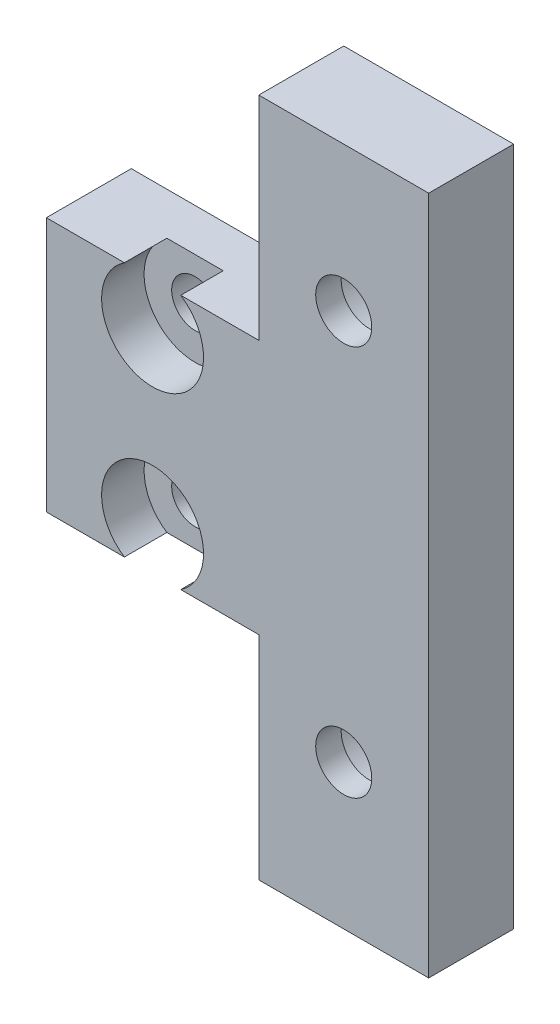
ISO-10303-21;
HEADER;
FILE_DESCRIPTION(('STEP AP214'),'2;1');
FILE_NAME('part.step','',(''),(''),'','','');
FILE_SCHEMA(('AUTOMOTIVE_DESIGN { 1 0 10303 214 1 1 1 1 }'));
ENDSEC;
DATA;
#1=APPLICATION_CONTEXT('core data for automotive mechanical design processes');
#2=APPLICATION_PROTOCOL_DEFINITION('international standard','automotive_design',2000,#1);
#3=PRODUCT_CONTEXT('',#1,'mechanical');
#4=PRODUCT('Part','Part','',(#3));
#5=PRODUCT_RELATED_PRODUCT_CATEGORY('part','',(#4));
#6=PRODUCT_DEFINITION_FORMATION('','',#4);
#7=PRODUCT_DEFINITION_CONTEXT('part definition',#1,'design');
#8=PRODUCT_DEFINITION('design','',#6,#7);
#9=PRODUCT_DEFINITION_SHAPE('','',#8);
#10=(LENGTH_UNIT() NAMED_UNIT(*) SI_UNIT(.MILLI.,.METRE.));
#11=(NAMED_UNIT(*) PLANE_ANGLE_UNIT() SI_UNIT($,.RADIAN.));
#12=(NAMED_UNIT(*) SI_UNIT($,.STERADIAN.) SOLID_ANGLE_UNIT());
#13=UNCERTAINTY_MEASURE_WITH_UNIT(LENGTH_MEASURE(1.E-05),#10,'distance_accuracy_value','');
#14=(GEOMETRIC_REPRESENTATION_CONTEXT(3) GLOBAL_UNCERTAINTY_ASSIGNED_CONTEXT((#13)) GLOBAL_UNIT_ASSIGNED_CONTEXT((#10,
#11,#12)) REPRESENTATION_CONTEXT('',''));
#15=CARTESIAN_POINT('',(0.,0.,0.));
#16=DIRECTION('',(0.,0.,1.));
#17=DIRECTION('',(1.,0.,0.));
#18=AXIS2_PLACEMENT_3D('',#15,#16,#17);
#19=CARTESIAN_POINT('',(-1.16433551558556,10.8998339602697,10.));
#20=DIRECTION('',(0.,0.,-1.));
#21=DIRECTION('',(-1.,0.,0.));
#22=AXIS2_PLACEMENT_3D('',#19,#20,#21);
#23=CYLINDRICAL_SURFACE('',#22,3.3);
#24=CARTESIAN_POINT('',(-1.16433551558556,10.8998339602697,10.));
#25=DIRECTION('',(0.,0.,1.));
#26=DIRECTION('',(1.,0.,0.));
#27=AXIS2_PLACEMENT_3D('',#24,#25,#26);
#28=CIRCLE('',#27,3.3);
#29=CARTESIAN_POINT('',(2.13566448441444,10.8998339602697,10.));
#30=VERTEX_POINT('',#29);
#31=EDGE_CURVE('E168',#30,#30,#28,.T.);
#32=ORIENTED_EDGE('',*,*,#31,.T.);
#33=EDGE_LOOP('',(#32));
#34=FACE_BOUND('',#33,.T.);
#35=CARTESIAN_POINT('',(-1.16433551558556,10.8998339602697,7.));
#36=DIRECTION('',(0.,0.,-1.));
#37=DIRECTION('',(-1.,0.,0.));
#38=AXIS2_PLACEMENT_3D('',#35,#36,#37);
#39=CIRCLE('',#38,3.3);
#40=CARTESIAN_POINT('',(-4.46433551558556,10.8998339602697,7.));
#41=VERTEX_POINT('',#40);
#42=EDGE_CURVE('E40',#41,#41,#39,.T.);
#43=ORIENTED_EDGE('',*,*,#42,.T.);
#44=EDGE_LOOP('',(#43));
#45=FACE_BOUND('',#44,.T.);
#46=ADVANCED_FACE('F36',(#34,#45),#23,.F.);
#47=CARTESIAN_POINT('',(-1.16433551558556,-35.1001660397303,10.));
#48=DIRECTION('',(0.,0.,-1.));
#49=DIRECTION('',(-1.,0.,0.));
#50=AXIS2_PLACEMENT_3D('',#47,#48,#49);
#51=CYLINDRICAL_SURFACE('',#50,3.3);
#52=CARTESIAN_POINT('',(-1.16433551558556,-35.1001660397303,10.));
#53=DIRECTION('',(0.,0.,1.));
#54=DIRECTION('',(1.,0.,0.));
#55=AXIS2_PLACEMENT_3D('',#52,#53,#54);
#56=CIRCLE('',#55,3.3);
#57=CARTESIAN_POINT('',(2.13566448441444,-35.1001660397303,10.));
#58=VERTEX_POINT('',#57);
#59=EDGE_CURVE('E246',#58,#58,#56,.T.);
#60=ORIENTED_EDGE('',*,*,#59,.T.);
#61=EDGE_LOOP('',(#60));
#62=FACE_BOUND('',#61,.T.);
#63=CARTESIAN_POINT('',(-1.16433551558556,-35.1001660397303,7.));
#64=DIRECTION('',(0.,0.,-1.));
#65=DIRECTION('',(-1.,0.,0.));
#66=AXIS2_PLACEMENT_3D('',#63,#64,#65);
#67=CIRCLE('',#66,3.3);
#68=CARTESIAN_POINT('',(-4.46433551558556,-35.1001660397303,7.));
#69=VERTEX_POINT('',#68);
#70=EDGE_CURVE('E214',#69,#69,#67,.T.);
#71=ORIENTED_EDGE('',*,*,#70,.T.);
#72=EDGE_LOOP('',(#71));
#73=FACE_BOUND('',#72,.T.);
#74=ADVANCED_FACE('F308',(#62,#73),#51,.F.);
#75=CARTESIAN_POINT('',(-23.6643355155856,-2.10016603973031,10.));
#76=DIRECTION('',(0.,0.,-1.));
#77=DIRECTION('',(-1.,0.,0.));
#78=AXIS2_PLACEMENT_3D('',#75,#76,#77);
#79=CYLINDRICAL_SURFACE('',#78,2.75);
#80=CARTESIAN_POINT('',(-23.6643355155856,-2.10016603973031,0.));
#81=DIRECTION('',(0.,0.,1.));
#82=DIRECTION('',(1.,0.,0.));
#83=AXIS2_PLACEMENT_3D('',#80,#81,#82);
#84=CIRCLE('',#83,2.75);
#85=CARTESIAN_POINT('',(-20.9143355155856,-2.10016603973031,0.));
#86=VERTEX_POINT('',#85);
#87=EDGE_CURVE('E243',#86,#86,#84,.T.);
#88=ORIENTED_EDGE('',*,*,#87,.F.);
#89=EDGE_LOOP('',(#88));
#90=FACE_BOUND('',#89,.T.);
#91=CARTESIAN_POINT('',(-23.6643355155856,-2.10016603973031,5.));
#92=DIRECTION('',(0.,0.,1.));
#93=DIRECTION('',(1.,0.,0.));
#94=AXIS2_PLACEMENT_3D('',#91,#92,#93);
#95=CIRCLE('',#94,2.75);
#96=CARTESIAN_POINT('',(-20.9143355155856,-2.10016603973031,5.));
#97=VERTEX_POINT('',#96);
#98=EDGE_CURVE('E208',#97,#97,#95,.T.);
#99=ORIENTED_EDGE('',*,*,#98,.T.);
#100=EDGE_LOOP('',(#99));
#101=FACE_BOUND('',#100,.T.);
#102=ADVANCED_FACE('F314',(#90,#101),#79,.F.);
#103=CARTESIAN_POINT('',(-23.6643355155856,-22.1001660397303,10.));
#104=DIRECTION('',(0.,0.,-1.));
#105=DIRECTION('',(-1.,0.,0.));
#106=AXIS2_PLACEMENT_3D('',#103,#104,#105);
#107=CYLINDRICAL_SURFACE('',#106,2.75);
#108=CARTESIAN_POINT('',(-23.6643355155856,-22.1001660397303,0.));
#109=DIRECTION('',(0.,0.,1.));
#110=DIRECTION('',(1.,0.,0.));
#111=AXIS2_PLACEMENT_3D('',#108,#109,#110);
#112=CIRCLE('',#111,2.75);
#113=CARTESIAN_POINT('',(-20.9143355155856,-22.1001660397303,0.));
#114=VERTEX_POINT('',#113);
#115=EDGE_CURVE('E240',#114,#114,#112,.T.);
#116=ORIENTED_EDGE('',*,*,#115,.F.);
#117=EDGE_LOOP('',(#116));
#118=FACE_BOUND('',#117,.T.);
#119=CARTESIAN_POINT('',(-23.6643355155856,-22.1001660397303,5.));
#120=DIRECTION('',(0.,0.,1.));
#121=DIRECTION('',(1.,0.,0.));
#122=AXIS2_PLACEMENT_3D('',#119,#120,#121);
#123=CIRCLE('',#122,2.75);
#124=CARTESIAN_POINT('',(-20.9143355155856,-22.1001660397303,5.));
#125=VERTEX_POINT('',#124);
#126=EDGE_CURVE('E205',#125,#125,#123,.T.);
#127=ORIENTED_EDGE('',*,*,#126,.T.);
#128=EDGE_LOOP('',(#127));
#129=FACE_BOUND('',#128,.T.);
#130=ADVANCED_FACE('F322',(#118,#129),#107,.F.);
#131=CARTESIAN_POINT('',(0.,0.,10.));
#132=DIRECTION('',(0.,0.,-1.));
#133=DIRECTION('',(-1.,0.,0.));
#134=AXIS2_PLACEMENT_3D('',#131,#132,#133);
#135=PLANE('',#134);
#136=DIRECTION('',(-1.,0.,0.));
#137=VECTOR('',#136,1.);
#138=CARTESIAN_POINT('',(-11.1643355155856,2.89983396026969,10.));
#139=LINE('',#138,#137);
#140=CARTESIAN_POINT('',(-11.1643355155856,2.89983396026969,10.));
#141=VERTEX_POINT('',#140);
#142=CARTESIAN_POINT('',(-20.3477107252302,2.89983396026969,10.));
#143=VERTEX_POINT('',#142);
#144=EDGE_CURVE('E253',#141,#143,#139,.T.);
#145=ORIENTED_EDGE('',*,*,#144,.T.);
#146=CARTESIAN_POINT('',(-23.6643355155856,-2.10016603973031,10.));
#147=DIRECTION('',(0.,0.,1.));
#148=DIRECTION('',(1.,0.,0.));
#149=AXIS2_PLACEMENT_3D('',#146,#147,#148);
#150=CIRCLE('',#149,6.);
#151=CARTESIAN_POINT('',(-26.980960305941,2.89983396026969,10.));
#152=VERTEX_POINT('',#151);
#153=EDGE_CURVE('E235',#152,#143,#150,.T.);
#154=ORIENTED_EDGE('',*,*,#153,.F.);
#155=CARTESIAN_POINT('',(-36.1643355155856,2.89983396026969,10.));
#156=VERTEX_POINT('',#155);
#157=EDGE_CURVE('E252',#152,#156,#139,.T.);
#158=ORIENTED_EDGE('',*,*,#157,.T.);
#159=DIRECTION('',(0.,-1.,0.));
#160=VECTOR('',#159,1.);
#161=CARTESIAN_POINT('',(-36.1643355155856,2.89983396026969,10.));
#162=LINE('',#161,#160);
#163=CARTESIAN_POINT('',(-36.1643355155856,-27.1001660397303,10.));
#164=VERTEX_POINT('',#163);
#165=EDGE_CURVE('E148',#156,#164,#162,.T.);
#166=ORIENTED_EDGE('',*,*,#165,.T.);
#167=DIRECTION('',(1.,0.,0.));
#168=VECTOR('',#167,1.);
#169=CARTESIAN_POINT('',(-36.1643355155856,-27.1001660397303,10.));
#170=LINE('',#169,#168);
#171=CARTESIAN_POINT('',(-26.980960305941,-27.1001660397303,10.));
#172=VERTEX_POINT('',#171);
#173=EDGE_CURVE('E141',#164,#172,#170,.T.);
#174=ORIENTED_EDGE('',*,*,#173,.T.);
#175=CARTESIAN_POINT('',(-23.6643355155856,-22.1001660397303,10.));
#176=DIRECTION('',(0.,0.,1.));
#177=DIRECTION('',(1.,0.,0.));
#178=AXIS2_PLACEMENT_3D('',#175,#176,#177);
#179=CIRCLE('',#178,6.);
#180=CARTESIAN_POINT('',(-20.3477107252302,-27.1001660397303,10.));
#181=VERTEX_POINT('',#180);
#182=EDGE_CURVE('E126',#181,#172,#179,.T.);
#183=ORIENTED_EDGE('',*,*,#182,.F.);
#184=CARTESIAN_POINT('',(-11.1643355155856,-27.1001660397303,10.));
#185=VERTEX_POINT('',#184);
#186=EDGE_CURVE('E151',#181,#185,#170,.T.);
#187=ORIENTED_EDGE('',*,*,#186,.T.);
#188=DIRECTION('',(0.,-1.,0.));
#189=VECTOR('',#188,1.);
#190=CARTESIAN_POINT('',(-11.1643355155856,-27.1001660397303,10.));
#191=LINE('',#190,#189);
#192=CARTESIAN_POINT('',(-11.1643355155855,-52.1001660397303,10.));
#193=VERTEX_POINT('',#192);
#194=EDGE_CURVE('E150',#185,#193,#191,.T.);
#195=ORIENTED_EDGE('',*,*,#194,.T.);
#196=DIRECTION('',(1.,0.,0.));
#197=VECTOR('',#196,1.);
#198=CARTESIAN_POINT('',(-11.1643355155855,-52.1001660397303,10.));
#199=LINE('',#198,#197);
#200=CARTESIAN_POINT('',(8.83566448441443,-52.1001660397303,10.));
#201=VERTEX_POINT('',#200);
#202=EDGE_CURVE('E153',#193,#201,#199,.T.);
#203=ORIENTED_EDGE('',*,*,#202,.T.);
#204=DIRECTION('',(0.,1.,0.));
#205=VECTOR('',#204,1.);
#206=CARTESIAN_POINT('',(8.83566448441443,27.8998339602697,10.));
#207=LINE('',#206,#205);
#208=CARTESIAN_POINT('',(8.83566448441443,27.8998339602697,10.));
#209=VERTEX_POINT('',#208);
#210=EDGE_CURVE('E159',#201,#209,#207,.T.);
#211=ORIENTED_EDGE('',*,*,#210,.T.);
#212=DIRECTION('',(-1.,0.,0.));
#213=VECTOR('',#212,1.);
#214=CARTESIAN_POINT('',(8.83566448441443,27.8998339602697,10.));
#215=LINE('',#214,#213);
#216=CARTESIAN_POINT('',(-11.1643355155856,27.8998339602697,10.));
#217=VERTEX_POINT('',#216);
#218=EDGE_CURVE('E161',#209,#217,#215,.T.);
#219=ORIENTED_EDGE('',*,*,#218,.T.);
#220=DIRECTION('',(0.,-1.,0.));
#221=VECTOR('',#220,1.);
#222=CARTESIAN_POINT('',(-11.1643355155856,27.8998339602697,10.));
#223=LINE('',#222,#221);
#224=EDGE_CURVE('E182',#217,#141,#223,.T.);
#225=ORIENTED_EDGE('',*,*,#224,.T.);
#226=EDGE_LOOP('',(#145,#154,#158,#166,#174,#183,#187,#195,#203,#211,#219,#225));
#227=FACE_BOUND('',#226,.T.);
#228=ORIENTED_EDGE('',*,*,#31,.F.);
#229=EDGE_LOOP('',(#228));
#230=FACE_BOUND('',#229,.T.);
#231=ORIENTED_EDGE('',*,*,#59,.F.);
#232=EDGE_LOOP('',(#231));
#233=FACE_BOUND('',#232,.T.);
#234=ADVANCED_FACE('F145',(#227,#230,#233),#135,.F.);
#235=CARTESIAN_POINT('',(0.,0.,0.));
#236=DIRECTION('',(0.,0.,-1.));
#237=DIRECTION('',(-1.,0.,0.));
#238=AXIS2_PLACEMENT_3D('',#235,#236,#237);
#239=PLANE('',#238);
#240=CARTESIAN_POINT('',(-1.16433551558556,10.8998339602697,0.));
#241=DIRECTION('',(0.,0.,-1.));
#242=DIRECTION('',(-1.,0.,0.));
#243=AXIS2_PLACEMENT_3D('',#240,#241,#242);
#244=CIRCLE('',#243,7.);
#245=CARTESIAN_POINT('',(-8.16433551558556,10.8998339602697,0.));
#246=VERTEX_POINT('',#245);
#247=EDGE_CURVE('E221',#246,#246,#244,.T.);
#248=ORIENTED_EDGE('',*,*,#247,.F.);
#249=EDGE_LOOP('',(#248));
#250=FACE_BOUND('',#249,.T.);
#251=CARTESIAN_POINT('',(-1.16433551558556,-35.1001660397303,0.));
#252=DIRECTION('',(0.,0.,-1.));
#253=DIRECTION('',(-1.,0.,0.));
#254=AXIS2_PLACEMENT_3D('',#251,#252,#253);
#255=CIRCLE('',#254,7.);
#256=CARTESIAN_POINT('',(-8.16433551558556,-35.1001660397303,0.));
#257=VERTEX_POINT('',#256);
#258=EDGE_CURVE('E231',#257,#257,#255,.T.);
#259=ORIENTED_EDGE('',*,*,#258,.F.);
#260=EDGE_LOOP('',(#259));
#261=FACE_BOUND('',#260,.T.);
#262=ORIENTED_EDGE('',*,*,#87,.T.);
#263=EDGE_LOOP('',(#262));
#264=FACE_BOUND('',#263,.T.);
#265=DIRECTION('',(0.,-1.,0.));
#266=VECTOR('',#265,1.);
#267=CARTESIAN_POINT('',(-11.1643355155856,27.8998339602697,0.));
#268=LINE('',#267,#266);
#269=CARTESIAN_POINT('',(-11.1643355155856,27.8998339602697,0.));
#270=VERTEX_POINT('',#269);
#271=CARTESIAN_POINT('',(-11.1643355155856,2.89983396026969,0.));
#272=VERTEX_POINT('',#271);
#273=EDGE_CURVE('E164',#270,#272,#268,.T.);
#274=ORIENTED_EDGE('',*,*,#273,.F.);
#275=DIRECTION('',(-1.,0.,0.));
#276=VECTOR('',#275,1.);
#277=CARTESIAN_POINT('',(8.83566448441443,27.8998339602697,0.));
#278=LINE('',#277,#276);
#279=CARTESIAN_POINT('',(8.83566448441443,27.8998339602697,0.));
#280=VERTEX_POINT('',#279);
#281=EDGE_CURVE('E180',#280,#270,#278,.T.);
#282=ORIENTED_EDGE('',*,*,#281,.F.);
#283=DIRECTION('',(0.,1.,0.));
#284=VECTOR('',#283,1.);
#285=CARTESIAN_POINT('',(8.83566448441443,27.8998339602697,0.));
#286=LINE('',#285,#284);
#287=CARTESIAN_POINT('',(8.83566448441443,-52.1001660397303,0.));
#288=VERTEX_POINT('',#287);
#289=EDGE_CURVE('E178',#288,#280,#286,.T.);
#290=ORIENTED_EDGE('',*,*,#289,.F.);
#291=DIRECTION('',(1.,0.,0.));
#292=VECTOR('',#291,1.);
#293=CARTESIAN_POINT('',(-11.1643355155855,-52.1001660397303,0.));
#294=LINE('',#293,#292);
#295=CARTESIAN_POINT('',(-11.1643355155855,-52.1001660397303,0.));
#296=VERTEX_POINT('',#295);
#297=EDGE_CURVE('E176',#296,#288,#294,.T.);
#298=ORIENTED_EDGE('',*,*,#297,.F.);
#299=DIRECTION('',(0.,-1.,0.));
#300=VECTOR('',#299,1.);
#301=CARTESIAN_POINT('',(-11.1643355155856,-27.1001660397303,0.));
#302=LINE('',#301,#300);
#303=CARTESIAN_POINT('',(-11.1643355155856,-27.1001660397303,0.));
#304=VERTEX_POINT('',#303);
#305=EDGE_CURVE('E174',#304,#296,#302,.T.);
#306=ORIENTED_EDGE('',*,*,#305,.F.);
#307=DIRECTION('',(1.,0.,0.));
#308=VECTOR('',#307,1.);
#309=CARTESIAN_POINT('',(-36.1643355155856,-27.1001660397303,0.));
#310=LINE('',#309,#308);
#311=CARTESIAN_POINT('',(-36.1643355155856,-27.1001660397303,0.));
#312=VERTEX_POINT('',#311);
#313=EDGE_CURVE('E172',#312,#304,#310,.T.);
#314=ORIENTED_EDGE('',*,*,#313,.F.);
#315=DIRECTION('',(0.,-1.,0.));
#316=VECTOR('',#315,1.);
#317=CARTESIAN_POINT('',(-36.1643355155856,2.89983396026969,0.));
#318=LINE('',#317,#316);
#319=CARTESIAN_POINT('',(-36.1643355155856,2.89983396026969,0.));
#320=VERTEX_POINT('',#319);
#321=EDGE_CURVE('E170',#320,#312,#318,.T.);
#322=ORIENTED_EDGE('',*,*,#321,.F.);
#323=DIRECTION('',(-1.,0.,0.));
#324=VECTOR('',#323,1.);
#325=CARTESIAN_POINT('',(-11.1643355155856,2.89983396026969,0.));
#326=LINE('',#325,#324);
#327=EDGE_CURVE('E167',#272,#320,#326,.T.);
#328=ORIENTED_EDGE('',*,*,#327,.F.);
#329=EDGE_LOOP('',(#274,#282,#290,#298,#306,#314,#322,#328));
#330=FACE_BOUND('',#329,.T.);
#331=ORIENTED_EDGE('',*,*,#115,.T.);
#332=EDGE_LOOP('',(#331));
#333=FACE_BOUND('',#332,.T.);
#334=ADVANCED_FACE('F268',(#250,#261,#264,#330,#333),#239,.T.);
#335=CARTESIAN_POINT('',(-11.1643355155856,27.8998339602697,10.));
#336=DIRECTION('',(1.,0.,0.));
#337=DIRECTION('',(0.,1.,0.));
#338=AXIS2_PLACEMENT_3D('',#335,#336,#337);
#339=PLANE('',#338);
#340=ORIENTED_EDGE('',*,*,#273,.T.);
#341=DIRECTION('',(0.,0.,-1.));
#342=VECTOR('',#341,1.);
#343=CARTESIAN_POINT('',(-11.1643355155856,2.89983396026969,10.));
#344=LINE('',#343,#342);
#345=EDGE_CURVE('E202',#141,#272,#344,.T.);
#346=ORIENTED_EDGE('',*,*,#345,.F.);
#347=ORIENTED_EDGE('',*,*,#224,.F.);
#348=DIRECTION('',(0.,0.,-1.));
#349=VECTOR('',#348,1.);
#350=CARTESIAN_POINT('',(-11.1643355155856,27.8998339602697,10.));
#351=LINE('',#350,#349);
#352=EDGE_CURVE('E163',#217,#270,#351,.T.);
#353=ORIENTED_EDGE('',*,*,#352,.T.);
#354=EDGE_LOOP('',(#340,#346,#347,#353));
#355=FACE_BOUND('',#354,.T.);
#356=ADVANCED_FACE('F38',(#355),#339,.F.);
#357=CARTESIAN_POINT('',(-11.1643355155856,2.89983396026969,10.));
#358=DIRECTION('',(0.,-1.,0.));
#359=DIRECTION('',(1.,0.,0.));
#360=AXIS2_PLACEMENT_3D('',#357,#358,#359);
#361=PLANE('',#360);
#362=DIRECTION('',(-1.,0.,0.));
#363=VECTOR('',#362,1.);
#364=CARTESIAN_POINT('',(-11.1643355155856,2.89983396026969,5.));
#365=LINE('',#364,#363);
#366=CARTESIAN_POINT('',(-20.3477107252302,2.89983396026969,5.));
#367=VERTEX_POINT('',#366);
#368=CARTESIAN_POINT('',(-26.980960305941,2.89983396026969,5.));
#369=VERTEX_POINT('',#368);
#370=EDGE_CURVE('E211',#367,#369,#365,.T.);
#371=ORIENTED_EDGE('',*,*,#370,.F.);
#372=DIRECTION('',(0.,0.,1.));
#373=VECTOR('',#372,1.);
#374=CARTESIAN_POINT('',(-20.3477107252302,2.89983396026969,5.));
#375=LINE('',#374,#373);
#376=EDGE_CURVE('E11',#367,#143,#375,.T.);
#377=ORIENTED_EDGE('',*,*,#376,.T.);
#378=ORIENTED_EDGE('',*,*,#144,.F.);
#379=ORIENTED_EDGE('',*,*,#345,.T.);
#380=ORIENTED_EDGE('',*,*,#327,.T.);
#381=DIRECTION('',(0.,0.,-1.));
#382=VECTOR('',#381,1.);
#383=CARTESIAN_POINT('',(-36.1643355155856,2.89983396026969,10.));
#384=LINE('',#383,#382);
#385=EDGE_CURVE('E199',#156,#320,#384,.T.);
#386=ORIENTED_EDGE('',*,*,#385,.F.);
#387=ORIENTED_EDGE('',*,*,#157,.F.);
#388=DIRECTION('',(0.,0.,1.));
#389=VECTOR('',#388,1.);
#390=CARTESIAN_POINT('',(-26.980960305941,2.89983396026969,5.));
#391=LINE('',#390,#389);
#392=EDGE_CURVE('E45',#152,#369,#391,.F.);
#393=ORIENTED_EDGE('',*,*,#392,.T.);
#394=EDGE_LOOP('',(#371,#377,#378,#379,#380,#386,#387,#393));
#395=FACE_BOUND('',#394,.T.);
#396=ADVANCED_FACE('F259',(#395),#361,.F.);
#397=CARTESIAN_POINT('',(-36.1643355155856,2.89983396026969,10.));
#398=DIRECTION('',(1.,0.,0.));
#399=DIRECTION('',(0.,0.,-1.));
#400=AXIS2_PLACEMENT_3D('',#397,#398,#399);
#401=PLANE('',#400);
#402=ORIENTED_EDGE('',*,*,#321,.T.);
#403=DIRECTION('',(0.,0.,-1.));
#404=VECTOR('',#403,1.);
#405=CARTESIAN_POINT('',(-36.1643355155856,-27.1001660397303,10.));
#406=LINE('',#405,#404);
#407=EDGE_CURVE('E197',#164,#312,#406,.T.);
#408=ORIENTED_EDGE('',*,*,#407,.F.);
#409=ORIENTED_EDGE('',*,*,#165,.F.);
#410=ORIENTED_EDGE('',*,*,#385,.T.);
#411=EDGE_LOOP('',(#402,#408,#409,#410));
#412=FACE_BOUND('',#411,.T.);
#413=ADVANCED_FACE('F262',(#412),#401,.F.);
#414=CARTESIAN_POINT('',(-36.1643355155856,-27.1001660397303,10.));
#415=DIRECTION('',(0.,1.,0.));
#416=DIRECTION('',(0.,0.,1.));
#417=AXIS2_PLACEMENT_3D('',#414,#415,#416);
#418=PLANE('',#417);
#419=DIRECTION('',(1.,0.,0.));
#420=VECTOR('',#419,1.);
#421=CARTESIAN_POINT('',(-36.1643355155856,-27.1001660397303,5.));
#422=LINE('',#421,#420);
#423=CARTESIAN_POINT('',(-26.980960305941,-27.1001660397303,5.));
#424=VERTEX_POINT('',#423);
#425=CARTESIAN_POINT('',(-20.3477107252302,-27.1001660397303,5.));
#426=VERTEX_POINT('',#425);
#427=EDGE_CURVE('E142',#424,#426,#422,.T.);
#428=ORIENTED_EDGE('',*,*,#427,.F.);
#429=DIRECTION('',(0.,0.,1.));
#430=VECTOR('',#429,1.);
#431=CARTESIAN_POINT('',(-26.980960305941,-27.1001660397303,5.));
#432=LINE('',#431,#430);
#433=EDGE_CURVE('E129',#424,#172,#432,.T.);
#434=ORIENTED_EDGE('',*,*,#433,.T.);
#435=ORIENTED_EDGE('',*,*,#173,.F.);
#436=ORIENTED_EDGE('',*,*,#407,.T.);
#437=ORIENTED_EDGE('',*,*,#313,.T.);
#438=DIRECTION('',(0.,0.,-1.));
#439=VECTOR('',#438,1.);
#440=CARTESIAN_POINT('',(-11.1643355155856,-27.1001660397303,10.));
#441=LINE('',#440,#439);
#442=EDGE_CURVE('E194',#185,#304,#441,.T.);
#443=ORIENTED_EDGE('',*,*,#442,.F.);
#444=ORIENTED_EDGE('',*,*,#186,.F.);
#445=DIRECTION('',(0.,0.,1.));
#446=VECTOR('',#445,1.);
#447=CARTESIAN_POINT('',(-20.3477107252302,-27.1001660397303,5.));
#448=LINE('',#447,#446);
#449=EDGE_CURVE('E132',#181,#426,#448,.F.);
#450=ORIENTED_EDGE('',*,*,#449,.T.);
#451=EDGE_LOOP('',(#428,#434,#435,#436,#437,#443,#444,#450));
#452=FACE_BOUND('',#451,.T.);
#453=ADVANCED_FACE('F139',(#452),#418,.F.);
#454=CARTESIAN_POINT('',(-11.1643355155856,-27.1001660397303,10.));
#455=DIRECTION('',(1.,0.,0.));
#456=DIRECTION('',(0.,1.,0.));
#457=AXIS2_PLACEMENT_3D('',#454,#455,#456);
#458=PLANE('',#457);
#459=ORIENTED_EDGE('',*,*,#305,.T.);
#460=DIRECTION('',(0.,0.,-1.));
#461=VECTOR('',#460,1.);
#462=CARTESIAN_POINT('',(-11.1643355155855,-52.1001660397303,10.));
#463=LINE('',#462,#461);
#464=EDGE_CURVE('E191',#193,#296,#463,.T.);
#465=ORIENTED_EDGE('',*,*,#464,.F.);
#466=ORIENTED_EDGE('',*,*,#194,.F.);
#467=ORIENTED_EDGE('',*,*,#442,.T.);
#468=EDGE_LOOP('',(#459,#465,#466,#467));
#469=FACE_BOUND('',#468,.T.);
#470=ADVANCED_FACE('F274',(#469),#458,.F.);
#471=CARTESIAN_POINT('',(-11.1643355155855,-52.1001660397303,10.));
#472=DIRECTION('',(0.,1.,0.));
#473=DIRECTION('',(0.,0.,1.));
#474=AXIS2_PLACEMENT_3D('',#471,#472,#473);
#475=PLANE('',#474);
#476=ORIENTED_EDGE('',*,*,#297,.T.);
#477=DIRECTION('',(0.,0.,-1.));
#478=VECTOR('',#477,1.);
#479=CARTESIAN_POINT('',(8.83566448441443,-52.1001660397303,10.));
#480=LINE('',#479,#478);
#481=EDGE_CURVE('E188',#201,#288,#480,.T.);
#482=ORIENTED_EDGE('',*,*,#481,.F.);
#483=ORIENTED_EDGE('',*,*,#202,.F.);
#484=ORIENTED_EDGE('',*,*,#464,.T.);
#485=EDGE_LOOP('',(#476,#482,#483,#484));
#486=FACE_BOUND('',#485,.T.);
#487=ADVANCED_FACE('F278',(#486),#475,.F.);
#488=CARTESIAN_POINT('',(8.83566448441443,27.8998339602697,10.));
#489=DIRECTION('',(-1.,0.,0.));
#490=DIRECTION('',(0.,0.,1.));
#491=AXIS2_PLACEMENT_3D('',#488,#489,#490);
#492=PLANE('',#491);
#493=ORIENTED_EDGE('',*,*,#289,.T.);
#494=DIRECTION('',(0.,0.,-1.));
#495=VECTOR('',#494,1.);
#496=CARTESIAN_POINT('',(8.83566448441443,27.8998339602697,10.));
#497=LINE('',#496,#495);
#498=EDGE_CURVE('E185',#209,#280,#497,.T.);
#499=ORIENTED_EDGE('',*,*,#498,.F.);
#500=ORIENTED_EDGE('',*,*,#210,.F.);
#501=ORIENTED_EDGE('',*,*,#481,.T.);
#502=EDGE_LOOP('',(#493,#499,#500,#501));
#503=FACE_BOUND('',#502,.T.);
#504=ADVANCED_FACE('F285',(#503),#492,.F.);
#505=CARTESIAN_POINT('',(8.83566448441443,27.8998339602697,10.));
#506=DIRECTION('',(0.,-1.,0.));
#507=DIRECTION('',(1.,0.,0.));
#508=AXIS2_PLACEMENT_3D('',#505,#506,#507);
#509=PLANE('',#508);
#510=ORIENTED_EDGE('',*,*,#281,.T.);
#511=ORIENTED_EDGE('',*,*,#352,.F.);
#512=ORIENTED_EDGE('',*,*,#218,.F.);
#513=ORIENTED_EDGE('',*,*,#498,.T.);
#514=EDGE_LOOP('',(#510,#511,#512,#513));
#515=FACE_BOUND('',#514,.T.);
#516=ADVANCED_FACE('F288',(#515),#509,.F.);
#517=CARTESIAN_POINT('',(-23.6643355155856,-22.1001660397303,5.));
#518=DIRECTION('',(0.,0.,1.));
#519=DIRECTION('',(1.,0.,0.));
#520=AXIS2_PLACEMENT_3D('',#517,#518,#519);
#521=CYLINDRICAL_SURFACE('',#520,6.);
#522=CARTESIAN_POINT('',(-23.6643355155856,-22.1001660397303,5.));
#523=DIRECTION('',(0.,0.,1.));
#524=DIRECTION('',(1.,0.,0.));
#525=AXIS2_PLACEMENT_3D('',#522,#523,#524);
#526=CIRCLE('',#525,6.);
#527=EDGE_CURVE('E59',#426,#424,#526,.T.);
#528=ORIENTED_EDGE('',*,*,#527,.F.);
#529=ORIENTED_EDGE('',*,*,#449,.F.);
#530=ORIENTED_EDGE('',*,*,#182,.T.);
#531=ORIENTED_EDGE('',*,*,#433,.F.);
#532=EDGE_LOOP('',(#528,#529,#530,#531));
#533=FACE_BOUND('',#532,.T.);
#534=ADVANCED_FACE('F128',(#533),#521,.F.);
#535=CARTESIAN_POINT('',(-23.6643355155856,-22.1001660397303,5.));
#536=DIRECTION('',(0.,0.,1.));
#537=DIRECTION('',(1.,0.,0.));
#538=AXIS2_PLACEMENT_3D('',#535,#536,#537);
#539=PLANE('',#538);
#540=ORIENTED_EDGE('',*,*,#126,.F.);
#541=EDGE_LOOP('',(#540));
#542=FACE_BOUND('',#541,.T.);
#543=ORIENTED_EDGE('',*,*,#427,.T.);
#544=ORIENTED_EDGE('',*,*,#527,.T.);
#545=EDGE_LOOP('',(#543,#544));
#546=FACE_BOUND('',#545,.T.);
#547=ADVANCED_FACE('F296',(#542,#546),#539,.T.);
#548=CARTESIAN_POINT('',(-23.6643355155856,-2.10016603973031,5.));
#549=DIRECTION('',(0.,0.,1.));
#550=DIRECTION('',(1.,0.,0.));
#551=AXIS2_PLACEMENT_3D('',#548,#549,#550);
#552=CYLINDRICAL_SURFACE('',#551,6.);
#553=CARTESIAN_POINT('',(-23.6643355155856,-2.10016603973031,5.));
#554=DIRECTION('',(0.,0.,1.));
#555=DIRECTION('',(1.,0.,0.));
#556=AXIS2_PLACEMENT_3D('',#553,#554,#555);
#557=CIRCLE('',#556,6.);
#558=EDGE_CURVE('E52',#369,#367,#557,.T.);
#559=ORIENTED_EDGE('',*,*,#558,.F.);
#560=ORIENTED_EDGE('',*,*,#392,.F.);
#561=ORIENTED_EDGE('',*,*,#153,.T.);
#562=ORIENTED_EDGE('',*,*,#376,.F.);
#563=EDGE_LOOP('',(#559,#560,#561,#562));
#564=FACE_BOUND('',#563,.T.);
#565=ADVANCED_FACE('F293',(#564),#552,.F.);
#566=CARTESIAN_POINT('',(-23.6643355155856,-2.10016603973031,5.));
#567=DIRECTION('',(0.,0.,1.));
#568=DIRECTION('',(1.,0.,0.));
#569=AXIS2_PLACEMENT_3D('',#566,#567,#568);
#570=PLANE('',#569);
#571=ORIENTED_EDGE('',*,*,#98,.F.);
#572=EDGE_LOOP('',(#571));
#573=FACE_BOUND('',#572,.T.);
#574=ORIENTED_EDGE('',*,*,#370,.T.);
#575=ORIENTED_EDGE('',*,*,#558,.T.);
#576=EDGE_LOOP('',(#574,#575));
#577=FACE_BOUND('',#576,.T.);
#578=ADVANCED_FACE('F295',(#573,#577),#570,.T.);
#579=CARTESIAN_POINT('',(-1.16433551558556,-35.1001660397303,7.));
#580=DIRECTION('',(0.,0.,-1.));
#581=DIRECTION('',(-1.,0.,0.));
#582=AXIS2_PLACEMENT_3D('',#579,#580,#581);
#583=CYLINDRICAL_SURFACE('',#582,7.);
#584=CARTESIAN_POINT('',(-1.16433551558556,-35.1001660397303,7.));
#585=DIRECTION('',(0.,0.,-1.));
#586=DIRECTION('',(-1.,0.,0.));
#587=AXIS2_PLACEMENT_3D('',#584,#585,#586);
#588=CIRCLE('',#587,7.);
#589=CARTESIAN_POINT('',(-8.16433551558556,-35.1001660397303,7.));
#590=VERTEX_POINT('',#589);
#591=EDGE_CURVE('E226',#590,#590,#588,.T.);
#592=ORIENTED_EDGE('',*,*,#591,.F.);
#593=EDGE_LOOP('',(#592));
#594=FACE_BOUND('',#593,.T.);
#595=ORIENTED_EDGE('',*,*,#258,.T.);
#596=EDGE_LOOP('',(#595));
#597=FACE_BOUND('',#596,.T.);
#598=ADVANCED_FACE('F302',(#594,#597),#583,.F.);
#599=CARTESIAN_POINT('',(-1.16433551558556,-35.1001660397303,7.));
#600=DIRECTION('',(0.,0.,-1.));
#601=DIRECTION('',(-1.,0.,0.));
#602=AXIS2_PLACEMENT_3D('',#599,#600,#601);
#603=PLANE('',#602);
#604=ORIENTED_EDGE('',*,*,#70,.F.);
#605=EDGE_LOOP('',(#604));
#606=FACE_BOUND('',#605,.T.);
#607=ORIENTED_EDGE('',*,*,#591,.T.);
#608=EDGE_LOOP('',(#607));
#609=FACE_BOUND('',#608,.T.);
#610=ADVANCED_FACE('F455',(#606,#609),#603,.T.);
#611=CARTESIAN_POINT('',(-1.16433551558556,10.8998339602697,7.));
#612=DIRECTION('',(0.,0.,-1.));
#613=DIRECTION('',(-1.,0.,0.));
#614=AXIS2_PLACEMENT_3D('',#611,#612,#613);
#615=CYLINDRICAL_SURFACE('',#614,7.);
#616=CARTESIAN_POINT('',(-1.16433551558556,10.8998339602697,7.));
#617=DIRECTION('',(0.,0.,-1.));
#618=DIRECTION('',(-1.,0.,0.));
#619=AXIS2_PLACEMENT_3D('',#616,#617,#618);
#620=CIRCLE('',#619,7.);
#621=CARTESIAN_POINT('',(-8.16433551558556,10.8998339602697,7.));
#622=VERTEX_POINT('',#621);
#623=EDGE_CURVE('E216',#622,#622,#620,.T.);
#624=ORIENTED_EDGE('',*,*,#623,.F.);
#625=EDGE_LOOP('',(#624));
#626=FACE_BOUND('',#625,.T.);
#627=ORIENTED_EDGE('',*,*,#247,.T.);
#628=EDGE_LOOP('',(#627));
#629=FACE_BOUND('',#628,.T.);
#630=ADVANCED_FACE('F462',(#626,#629),#615,.F.);
#631=CARTESIAN_POINT('',(-1.16433551558556,10.8998339602697,7.));
#632=DIRECTION('',(0.,0.,-1.));
#633=DIRECTION('',(-1.,0.,0.));
#634=AXIS2_PLACEMENT_3D('',#631,#632,#633);
#635=PLANE('',#634);
#636=ORIENTED_EDGE('',*,*,#42,.F.);
#637=EDGE_LOOP('',(#636));
#638=FACE_BOUND('',#637,.T.);
#639=ORIENTED_EDGE('',*,*,#623,.T.);
#640=EDGE_LOOP('',(#639));
#641=FACE_BOUND('',#640,.T.);
#642=ADVANCED_FACE('F470',(#638,#641),#635,.T.);
#643=CLOSED_SHELL('',(#46,#74,#102,#130,#234,#334,#356,#396,#413,#453,#470,#487,#504,#516,#534,
#547,#565,#578,#598,#610,#630,#642));
#644=MANIFOLD_SOLID_BREP('B2',#643);
#645=ADVANCED_BREP_SHAPE_REPRESENTATION('',(#18,#644),#14);
#646=SHAPE_DEFINITION_REPRESENTATION(#9,#645);
ENDSEC;
END-ISO-10303-21;
